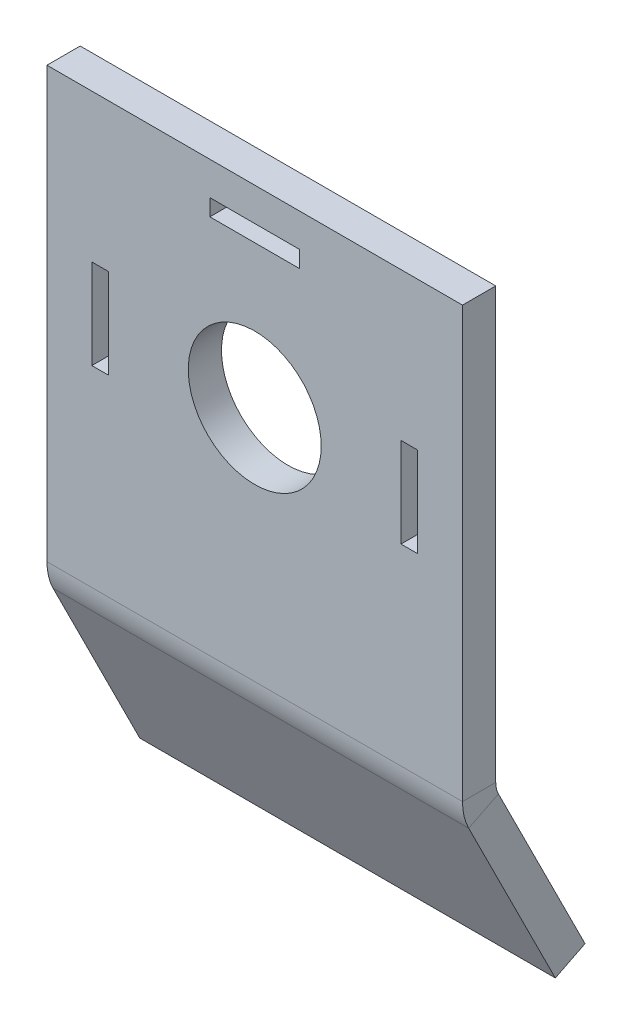
ISO-10303-21;
HEADER;
FILE_DESCRIPTION(('STEP AP214'),'2;1');
FILE_NAME('part.step','',(''),(''),'','','');
FILE_SCHEMA(('AUTOMOTIVE_DESIGN { 1 0 10303 214 1 1 1 1 }'));
ENDSEC;
DATA;
#1=APPLICATION_CONTEXT('core data for automotive mechanical design processes');
#2=APPLICATION_PROTOCOL_DEFINITION('international standard','automotive_design',2000,#1);
#3=PRODUCT_CONTEXT('',#1,'mechanical');
#4=PRODUCT('Part','Part','',(#3));
#5=PRODUCT_RELATED_PRODUCT_CATEGORY('part','',(#4));
#6=PRODUCT_DEFINITION_FORMATION('','',#4);
#7=PRODUCT_DEFINITION_CONTEXT('part definition',#1,'design');
#8=PRODUCT_DEFINITION('design','',#6,#7);
#9=PRODUCT_DEFINITION_SHAPE('','',#8);
#10=(LENGTH_UNIT() NAMED_UNIT(*) SI_UNIT(.MILLI.,.METRE.));
#11=(NAMED_UNIT(*) PLANE_ANGLE_UNIT() SI_UNIT($,.RADIAN.));
#12=(NAMED_UNIT(*) SI_UNIT($,.STERADIAN.) SOLID_ANGLE_UNIT());
#13=UNCERTAINTY_MEASURE_WITH_UNIT(LENGTH_MEASURE(1.E-05),#10,'distance_accuracy_value','');
#14=(GEOMETRIC_REPRESENTATION_CONTEXT(3) GLOBAL_UNCERTAINTY_ASSIGNED_CONTEXT((#13)) GLOBAL_UNIT_ASSIGNED_CONTEXT((#10,
#11,#12)) REPRESENTATION_CONTEXT('',''));
#15=CARTESIAN_POINT('',(0.,0.,0.));
#16=DIRECTION('',(0.,0.,1.));
#17=DIRECTION('',(1.,0.,0.));
#18=AXIS2_PLACEMENT_3D('',#15,#16,#17);
#19=CARTESIAN_POINT('',(-6.25,6.675,0.));
#20=DIRECTION('',(-1.,0.,0.));
#21=DIRECTION('',(0.,-1.,0.));
#22=AXIS2_PLACEMENT_3D('',#19,#20,#21);
#23=PLANE('',#22);
#24=DIRECTION('',(0.,1.,0.));
#25=VECTOR('',#24,1.);
#26=CARTESIAN_POINT('',(-6.25,0.,-1.));
#27=LINE('',#26,#25);
#28=CARTESIAN_POINT('',(-6.25,6.675,-1.));
#29=VERTEX_POINT('',#28);
#30=CARTESIAN_POINT('',(-6.25,-6.25895362992657,-1.));
#31=VERTEX_POINT('',#30);
#32=EDGE_CURVE('E162',#29,#31,#27,.F.);
#33=ORIENTED_EDGE('',*,*,#32,.T.);
#34=DIRECTION('',(0.,0.,1.));
#35=VECTOR('',#34,1.);
#36=CARTESIAN_POINT('',(-6.25,-6.25895362992657,-1.));
#37=LINE('',#36,#35);
#38=CARTESIAN_POINT('',(-6.25,-6.25895362992657,0.));
#39=VERTEX_POINT('',#38);
#40=EDGE_CURVE('E269',#31,#39,#37,.T.);
#41=ORIENTED_EDGE('',*,*,#40,.T.);
#42=DIRECTION('',(0.,-1.,0.));
#43=VECTOR('',#42,1.);
#44=CARTESIAN_POINT('',(-6.25,6.675,0.));
#45=LINE('',#44,#43);
#46=CARTESIAN_POINT('',(-6.25,6.675,0.));
#47=VERTEX_POINT('',#46);
#48=EDGE_CURVE('E314',#47,#39,#45,.T.);
#49=ORIENTED_EDGE('',*,*,#48,.F.);
#50=DIRECTION('',(0.,0.,1.));
#51=VECTOR('',#50,1.);
#52=CARTESIAN_POINT('',(-6.25,6.675,0.));
#53=LINE('',#52,#51);
#54=EDGE_CURVE('E150',#29,#47,#53,.T.);
#55=ORIENTED_EDGE('',*,*,#54,.F.);
#56=EDGE_LOOP('',(#33,#41,#49,#55));
#57=FACE_BOUND('',#56,.T.);
#58=ADVANCED_FACE('F65',(#57),#23,.T.);
#59=CARTESIAN_POINT('',(0.,0.,0.));
#60=DIRECTION('',(0.,0.,1.));
#61=DIRECTION('',(1.,0.,0.));
#62=AXIS2_PLACEMENT_3D('',#59,#60,#61);
#63=PLANE('',#62);
#64=DIRECTION('',(0.,1.,0.));
#65=VECTOR('',#64,1.);
#66=CARTESIAN_POINT('',(1.35,5.675,0.));
#67=LINE('',#66,#65);
#68=CARTESIAN_POINT('',(1.35,5.175,0.));
#69=VERTEX_POINT('',#68);
#70=CARTESIAN_POINT('',(1.35,5.675,0.));
#71=VERTEX_POINT('',#70);
#72=EDGE_CURVE('E171',#69,#71,#67,.T.);
#73=ORIENTED_EDGE('',*,*,#72,.F.);
#74=DIRECTION('',(1.,0.,0.));
#75=VECTOR('',#74,1.);
#76=CARTESIAN_POINT('',(-1.35,5.17500000000001,0.));
#77=LINE('',#76,#75);
#78=CARTESIAN_POINT('',(-1.35,5.17500000000001,0.));
#79=VERTEX_POINT('',#78);
#80=EDGE_CURVE('E340',#79,#69,#77,.T.);
#81=ORIENTED_EDGE('',*,*,#80,.F.);
#82=DIRECTION('',(0.,-1.,0.));
#83=VECTOR('',#82,1.);
#84=CARTESIAN_POINT('',(-1.35,5.675,0.));
#85=LINE('',#84,#83);
#86=CARTESIAN_POINT('',(-1.35,5.675,0.));
#87=VERTEX_POINT('',#86);
#88=EDGE_CURVE('E337',#87,#79,#85,.T.);
#89=ORIENTED_EDGE('',*,*,#88,.F.);
#90=DIRECTION('',(-1.,0.,0.));
#91=VECTOR('',#90,1.);
#92=CARTESIAN_POINT('',(-1.35,5.675,0.));
#93=LINE('',#92,#91);
#94=EDGE_CURVE('E334',#71,#87,#93,.T.);
#95=ORIENTED_EDGE('',*,*,#94,.F.);
#96=EDGE_LOOP('',(#73,#81,#89,#95));
#97=FACE_BOUND('',#96,.T.);
#98=DIRECTION('',(0.,1.,0.));
#99=VECTOR('',#98,1.);
#100=CARTESIAN_POINT('',(4.9,2.225,0.));
#101=LINE('',#100,#99);
#102=CARTESIAN_POINT('',(4.9,-0.474999999999997,0.));
#103=VERTEX_POINT('',#102);
#104=CARTESIAN_POINT('',(4.9,2.225,0.));
#105=VERTEX_POINT('',#104);
#106=EDGE_CURVE('E331',#103,#105,#101,.T.);
#107=ORIENTED_EDGE('',*,*,#106,.F.);
#108=DIRECTION('',(1.,0.,0.));
#109=VECTOR('',#108,1.);
#110=CARTESIAN_POINT('',(4.4,-0.474999999999998,0.));
#111=LINE('',#110,#109);
#112=CARTESIAN_POINT('',(4.4,-0.474999999999998,0.));
#113=VERTEX_POINT('',#112);
#114=EDGE_CURVE('E328',#113,#103,#111,.T.);
#115=ORIENTED_EDGE('',*,*,#114,.F.);
#116=DIRECTION('',(0.,-1.,0.));
#117=VECTOR('',#116,1.);
#118=CARTESIAN_POINT('',(4.4,2.225,0.));
#119=LINE('',#118,#117);
#120=CARTESIAN_POINT('',(4.4,2.225,0.));
#121=VERTEX_POINT('',#120);
#122=EDGE_CURVE('E325',#121,#113,#119,.T.);
#123=ORIENTED_EDGE('',*,*,#122,.F.);
#124=DIRECTION('',(-1.,0.,0.));
#125=VECTOR('',#124,1.);
#126=CARTESIAN_POINT('',(4.4,2.225,0.));
#127=LINE('',#126,#125);
#128=EDGE_CURVE('E322',#105,#121,#127,.T.);
#129=ORIENTED_EDGE('',*,*,#128,.F.);
#130=EDGE_LOOP('',(#107,#115,#123,#129));
#131=FACE_BOUND('',#130,.T.);
#132=CARTESIAN_POINT('',(0.,0.875000000000004,0.));
#133=DIRECTION('',(0.,0.,1.));
#134=DIRECTION('',(1.,0.,0.));
#135=AXIS2_PLACEMENT_3D('',#132,#133,#134);
#136=CIRCLE('',#135,2.);
#137=CARTESIAN_POINT('',(2.,0.875000000000004,0.));
#138=VERTEX_POINT('',#137);
#139=EDGE_CURVE('E311',#138,#138,#136,.T.);
#140=ORIENTED_EDGE('',*,*,#139,.F.);
#141=EDGE_LOOP('',(#140));
#142=FACE_BOUND('',#141,.T.);
#143=DIRECTION('',(-1.,0.,0.));
#144=VECTOR('',#143,1.);
#145=CARTESIAN_POINT('',(-4.4,-0.474999999999998,0.));
#146=LINE('',#145,#144);
#147=CARTESIAN_POINT('',(-4.4,-0.474999999999998,0.));
#148=VERTEX_POINT('',#147);
#149=CARTESIAN_POINT('',(-4.9,-0.474999999999997,0.));
#150=VERTEX_POINT('',#149);
#151=EDGE_CURVE('E316',#148,#150,#146,.T.);
#152=ORIENTED_EDGE('',*,*,#151,.T.);
#153=DIRECTION('',(0.,1.,0.));
#154=VECTOR('',#153,1.);
#155=CARTESIAN_POINT('',(-4.9,2.225,0.));
#156=LINE('',#155,#154);
#157=CARTESIAN_POINT('',(-4.9,2.225,0.));
#158=VERTEX_POINT('',#157);
#159=EDGE_CURVE('E146',#150,#158,#156,.T.);
#160=ORIENTED_EDGE('',*,*,#159,.T.);
#161=DIRECTION('',(1.,0.,0.));
#162=VECTOR('',#161,1.);
#163=CARTESIAN_POINT('',(-4.4,2.225,0.));
#164=LINE('',#163,#162);
#165=CARTESIAN_POINT('',(-4.4,2.225,0.));
#166=VERTEX_POINT('',#165);
#167=EDGE_CURVE('E208',#158,#166,#164,.T.);
#168=ORIENTED_EDGE('',*,*,#167,.T.);
#169=DIRECTION('',(0.,-1.,0.));
#170=VECTOR('',#169,1.);
#171=CARTESIAN_POINT('',(-4.4,2.225,0.));
#172=LINE('',#171,#170);
#173=EDGE_CURVE('E186',#166,#148,#172,.T.);
#174=ORIENTED_EDGE('',*,*,#173,.T.);
#175=EDGE_LOOP('',(#152,#160,#168,#174));
#176=FACE_BOUND('',#175,.T.);
#177=ORIENTED_EDGE('',*,*,#48,.T.);
#178=DIRECTION('',(-1.,0.,0.));
#179=VECTOR('',#178,1.);
#180=CARTESIAN_POINT('',(-6.25,-6.25895362992657,0.));
#181=LINE('',#180,#179);
#182=CARTESIAN_POINT('',(6.25,-6.25895362992657,0.));
#183=VERTEX_POINT('',#182);
#184=EDGE_CURVE('E310',#39,#183,#181,.F.);
#185=ORIENTED_EDGE('',*,*,#184,.T.);
#186=DIRECTION('',(0.,1.,0.));
#187=VECTOR('',#186,1.);
#188=CARTESIAN_POINT('',(6.25,6.675,0.));
#189=LINE('',#188,#187);
#190=CARTESIAN_POINT('',(6.25,6.675,0.));
#191=VERTEX_POINT('',#190);
#192=EDGE_CURVE('E308',#183,#191,#189,.T.);
#193=ORIENTED_EDGE('',*,*,#192,.T.);
#194=DIRECTION('',(-1.,0.,0.));
#195=VECTOR('',#194,1.);
#196=CARTESIAN_POINT('',(-6.25,6.675,0.));
#197=LINE('',#196,#195);
#198=EDGE_CURVE('E309',#191,#47,#197,.T.);
#199=ORIENTED_EDGE('',*,*,#198,.T.);
#200=EDGE_LOOP('',(#177,#185,#193,#199));
#201=FACE_BOUND('',#200,.T.);
#202=ADVANCED_FACE('F211',(#97,#131,#142,#176,#201),#63,.T.);
#203=CARTESIAN_POINT('',(0.,0.,-1.));
#204=DIRECTION('',(0.,0.,1.));
#205=DIRECTION('',(1.,0.,0.));
#206=AXIS2_PLACEMENT_3D('',#203,#204,#205);
#207=PLANE('',#206);
#208=DIRECTION('',(1.,0.,0.));
#209=VECTOR('',#208,1.);
#210=CARTESIAN_POINT('',(0.,-0.474999999999998,-1.));
#211=LINE('',#210,#209);
#212=CARTESIAN_POINT('',(-4.4,-0.474999999999998,-1.));
#213=VERTEX_POINT('',#212);
#214=CARTESIAN_POINT('',(-4.9,-0.474999999999997,-1.));
#215=VERTEX_POINT('',#214);
#216=EDGE_CURVE('E157',#213,#215,#211,.F.);
#217=ORIENTED_EDGE('',*,*,#216,.F.);
#218=DIRECTION('',(0.,1.,0.));
#219=VECTOR('',#218,1.);
#220=CARTESIAN_POINT('',(-4.4,0.,-1.));
#221=LINE('',#220,#219);
#222=CARTESIAN_POINT('',(-4.4,2.225,-1.));
#223=VERTEX_POINT('',#222);
#224=EDGE_CURVE('E169',#223,#213,#221,.F.);
#225=ORIENTED_EDGE('',*,*,#224,.F.);
#226=DIRECTION('',(1.,0.,0.));
#227=VECTOR('',#226,1.);
#228=CARTESIAN_POINT('',(0.,2.225,-1.));
#229=LINE('',#228,#227);
#230=CARTESIAN_POINT('',(-4.9,2.225,-1.));
#231=VERTEX_POINT('',#230);
#232=EDGE_CURVE('E159',#231,#223,#229,.T.);
#233=ORIENTED_EDGE('',*,*,#232,.F.);
#234=DIRECTION('',(0.,1.,0.));
#235=VECTOR('',#234,1.);
#236=CARTESIAN_POINT('',(-4.9,0.,-1.));
#237=LINE('',#236,#235);
#238=EDGE_CURVE('E143',#215,#231,#237,.T.);
#239=ORIENTED_EDGE('',*,*,#238,.F.);
#240=EDGE_LOOP('',(#217,#225,#233,#239));
#241=FACE_BOUND('',#240,.T.);
#242=CARTESIAN_POINT('',(0.,0.875000000000004,-1.));
#243=DIRECTION('',(0.,0.,1.));
#244=DIRECTION('',(1.,0.,0.));
#245=AXIS2_PLACEMENT_3D('',#242,#243,#244);
#246=CIRCLE('',#245,2.);
#247=CARTESIAN_POINT('',(2.,0.875000000000004,-1.));
#248=VERTEX_POINT('',#247);
#249=EDGE_CURVE('E238',#248,#248,#246,.T.);
#250=ORIENTED_EDGE('',*,*,#249,.T.);
#251=EDGE_LOOP('',(#250));
#252=FACE_BOUND('',#251,.T.);
#253=DIRECTION('',(0.,1.,0.));
#254=VECTOR('',#253,1.);
#255=CARTESIAN_POINT('',(4.9,0.,-1.));
#256=LINE('',#255,#254);
#257=CARTESIAN_POINT('',(4.9,-0.474999999999997,-1.));
#258=VERTEX_POINT('',#257);
#259=CARTESIAN_POINT('',(4.9,2.225,-1.));
#260=VERTEX_POINT('',#259);
#261=EDGE_CURVE('E226',#258,#260,#256,.T.);
#262=ORIENTED_EDGE('',*,*,#261,.T.);
#263=DIRECTION('',(1.,0.,0.));
#264=VECTOR('',#263,1.);
#265=CARTESIAN_POINT('',(0.,2.225,-1.));
#266=LINE('',#265,#264);
#267=CARTESIAN_POINT('',(4.4,2.225,-1.));
#268=VERTEX_POINT('',#267);
#269=EDGE_CURVE('E235',#260,#268,#266,.F.);
#270=ORIENTED_EDGE('',*,*,#269,.T.);
#271=DIRECTION('',(0.,1.,0.));
#272=VECTOR('',#271,1.);
#273=CARTESIAN_POINT('',(4.4,0.,-1.));
#274=LINE('',#273,#272);
#275=CARTESIAN_POINT('',(4.4,-0.474999999999998,-1.));
#276=VERTEX_POINT('',#275);
#277=EDGE_CURVE('E239',#268,#276,#274,.F.);
#278=ORIENTED_EDGE('',*,*,#277,.T.);
#279=DIRECTION('',(1.,0.,0.));
#280=VECTOR('',#279,1.);
#281=CARTESIAN_POINT('',(0.,-0.474999999999998,-1.));
#282=LINE('',#281,#280);
#283=EDGE_CURVE('E234',#276,#258,#282,.T.);
#284=ORIENTED_EDGE('',*,*,#283,.T.);
#285=EDGE_LOOP('',(#262,#270,#278,#284));
#286=FACE_BOUND('',#285,.T.);
#287=DIRECTION('',(0.,1.,0.));
#288=VECTOR('',#287,1.);
#289=CARTESIAN_POINT('',(1.35,0.,-1.));
#290=LINE('',#289,#288);
#291=CARTESIAN_POINT('',(1.35,5.175,-1.));
#292=VERTEX_POINT('',#291);
#293=CARTESIAN_POINT('',(1.35,5.675,-1.));
#294=VERTEX_POINT('',#293);
#295=EDGE_CURVE('E218',#292,#294,#290,.T.);
#296=ORIENTED_EDGE('',*,*,#295,.T.);
#297=DIRECTION('',(1.,0.,0.));
#298=VECTOR('',#297,1.);
#299=CARTESIAN_POINT('',(0.,5.675,-1.));
#300=LINE('',#299,#298);
#301=CARTESIAN_POINT('',(-1.35,5.675,-1.));
#302=VERTEX_POINT('',#301);
#303=EDGE_CURVE('E223',#294,#302,#300,.F.);
#304=ORIENTED_EDGE('',*,*,#303,.T.);
#305=DIRECTION('',(0.,1.,0.));
#306=VECTOR('',#305,1.);
#307=CARTESIAN_POINT('',(-1.35,0.,-1.));
#308=LINE('',#307,#306);
#309=CARTESIAN_POINT('',(-1.35,5.17500000000001,-1.));
#310=VERTEX_POINT('',#309);
#311=EDGE_CURVE('E227',#302,#310,#308,.F.);
#312=ORIENTED_EDGE('',*,*,#311,.T.);
#313=DIRECTION('',(1.,0.,0.));
#314=VECTOR('',#313,1.);
#315=CARTESIAN_POINT('',(0.,5.17500000000001,-1.));
#316=LINE('',#315,#314);
#317=EDGE_CURVE('E221',#310,#292,#316,.T.);
#318=ORIENTED_EDGE('',*,*,#317,.T.);
#319=EDGE_LOOP('',(#296,#304,#312,#318));
#320=FACE_BOUND('',#319,.T.);
#321=DIRECTION('',(-1.,0.,0.));
#322=VECTOR('',#321,1.);
#323=CARTESIAN_POINT('',(-6.25,-6.25895362992657,-1.));
#324=LINE('',#323,#322);
#325=CARTESIAN_POINT('',(6.25,-6.25895362992657,-1.));
#326=VERTEX_POINT('',#325);
#327=EDGE_CURVE('E264',#31,#326,#324,.F.);
#328=ORIENTED_EDGE('',*,*,#327,.F.);
#329=ORIENTED_EDGE('',*,*,#32,.F.);
#330=DIRECTION('',(1.,0.,0.));
#331=VECTOR('',#330,1.);
#332=CARTESIAN_POINT('',(0.,6.675,-1.));
#333=LINE('',#332,#331);
#334=CARTESIAN_POINT('',(6.25,6.675,-1.));
#335=VERTEX_POINT('',#334);
#336=EDGE_CURVE('E165',#335,#29,#333,.F.);
#337=ORIENTED_EDGE('',*,*,#336,.F.);
#338=DIRECTION('',(0.,1.,0.));
#339=VECTOR('',#338,1.);
#340=CARTESIAN_POINT('',(6.25,0.,-1.));
#341=LINE('',#340,#339);
#342=EDGE_CURVE('E246',#326,#335,#341,.T.);
#343=ORIENTED_EDGE('',*,*,#342,.F.);
#344=EDGE_LOOP('',(#328,#329,#337,#343));
#345=FACE_BOUND('',#344,.T.);
#346=ADVANCED_FACE('F154',(#241,#252,#286,#320,#345),#207,.F.);
#347=CARTESIAN_POINT('',(-4.4,2.225,0.));
#348=DIRECTION('',(0.,-1.,0.));
#349=DIRECTION('',(1.,0.,0.));
#350=AXIS2_PLACEMENT_3D('',#347,#348,#349);
#351=PLANE('',#350);
#352=DIRECTION('',(0.,0.,1.));
#353=VECTOR('',#352,1.);
#354=CARTESIAN_POINT('',(-4.9,2.225,0.));
#355=LINE('',#354,#353);
#356=EDGE_CURVE('E13',#231,#158,#355,.T.);
#357=ORIENTED_EDGE('',*,*,#356,.F.);
#358=ORIENTED_EDGE('',*,*,#232,.T.);
#359=DIRECTION('',(0.,0.,1.));
#360=VECTOR('',#359,1.);
#361=CARTESIAN_POINT('',(-4.4,2.225,0.));
#362=LINE('',#361,#360);
#363=EDGE_CURVE('E74',#223,#166,#362,.T.);
#364=ORIENTED_EDGE('',*,*,#363,.T.);
#365=ORIENTED_EDGE('',*,*,#167,.F.);
#366=EDGE_LOOP('',(#357,#358,#364,#365));
#367=FACE_BOUND('',#366,.T.);
#368=ADVANCED_FACE('F207',(#367),#351,.T.);
#369=CARTESIAN_POINT('',(-4.4,2.225,0.));
#370=DIRECTION('',(-1.,0.,0.));
#371=DIRECTION('',(0.,-1.,0.));
#372=AXIS2_PLACEMENT_3D('',#369,#370,#371);
#373=PLANE('',#372);
#374=ORIENTED_EDGE('',*,*,#363,.F.);
#375=ORIENTED_EDGE('',*,*,#224,.T.);
#376=DIRECTION('',(0.,0.,1.));
#377=VECTOR('',#376,1.);
#378=CARTESIAN_POINT('',(-4.4,-0.474999999999998,0.));
#379=LINE('',#378,#377);
#380=EDGE_CURVE('E90',#213,#148,#379,.T.);
#381=ORIENTED_EDGE('',*,*,#380,.T.);
#382=ORIENTED_EDGE('',*,*,#173,.F.);
#383=EDGE_LOOP('',(#374,#375,#381,#382));
#384=FACE_BOUND('',#383,.T.);
#385=ADVANCED_FACE('F214',(#384),#373,.T.);
#386=CARTESIAN_POINT('',(-4.4,-0.474999999999998,0.));
#387=DIRECTION('',(0.,1.,0.));
#388=DIRECTION('',(-1.,0.,0.));
#389=AXIS2_PLACEMENT_3D('',#386,#387,#388);
#390=PLANE('',#389);
#391=ORIENTED_EDGE('',*,*,#380,.F.);
#392=ORIENTED_EDGE('',*,*,#216,.T.);
#393=DIRECTION('',(0.,0.,1.));
#394=VECTOR('',#393,1.);
#395=CARTESIAN_POINT('',(-4.9,-0.474999999999997,0.));
#396=LINE('',#395,#394);
#397=EDGE_CURVE('E69',#215,#150,#396,.T.);
#398=ORIENTED_EDGE('',*,*,#397,.T.);
#399=ORIENTED_EDGE('',*,*,#151,.F.);
#400=EDGE_LOOP('',(#391,#392,#398,#399));
#401=FACE_BOUND('',#400,.T.);
#402=ADVANCED_FACE('F161',(#401),#390,.T.);
#403=CARTESIAN_POINT('',(6.25,6.675,0.));
#404=DIRECTION('',(1.,0.,0.));
#405=DIRECTION('',(0.,1.,0.));
#406=AXIS2_PLACEMENT_3D('',#403,#404,#405);
#407=PLANE('',#406);
#408=DIRECTION('',(0.,0.,1.));
#409=VECTOR('',#408,1.);
#410=CARTESIAN_POINT('',(6.25,-6.25895362992657,-1.));
#411=LINE('',#410,#409);
#412=EDGE_CURVE('E222',#326,#183,#411,.T.);
#413=ORIENTED_EDGE('',*,*,#412,.F.);
#414=ORIENTED_EDGE('',*,*,#342,.T.);
#415=DIRECTION('',(0.,0.,1.));
#416=VECTOR('',#415,1.);
#417=CARTESIAN_POINT('',(6.25,6.675,0.));
#418=LINE('',#417,#416);
#419=EDGE_CURVE('E196',#335,#191,#418,.T.);
#420=ORIENTED_EDGE('',*,*,#419,.T.);
#421=ORIENTED_EDGE('',*,*,#192,.F.);
#422=EDGE_LOOP('',(#413,#414,#420,#421));
#423=FACE_BOUND('',#422,.T.);
#424=ADVANCED_FACE('F313',(#423),#407,.T.);
#425=CARTESIAN_POINT('',(4.4,2.225,0.));
#426=DIRECTION('',(-1.,0.,0.));
#427=DIRECTION('',(0.,-1.,0.));
#428=AXIS2_PLACEMENT_3D('',#425,#426,#427);
#429=PLANE('',#428);
#430=DIRECTION('',(0.,0.,1.));
#431=VECTOR('',#430,1.);
#432=CARTESIAN_POINT('',(4.4,-0.474999999999998,0.));
#433=LINE('',#432,#431);
#434=EDGE_CURVE('E193',#276,#113,#433,.T.);
#435=ORIENTED_EDGE('',*,*,#434,.F.);
#436=ORIENTED_EDGE('',*,*,#277,.F.);
#437=DIRECTION('',(0.,0.,1.));
#438=VECTOR('',#437,1.);
#439=CARTESIAN_POINT('',(4.4,2.225,0.));
#440=LINE('',#439,#438);
#441=EDGE_CURVE('E190',#268,#121,#440,.T.);
#442=ORIENTED_EDGE('',*,*,#441,.T.);
#443=ORIENTED_EDGE('',*,*,#122,.T.);
#444=EDGE_LOOP('',(#435,#436,#442,#443));
#445=FACE_BOUND('',#444,.T.);
#446=ADVANCED_FACE('F497',(#445),#429,.F.);
#447=CARTESIAN_POINT('',(4.4,2.225,0.));
#448=DIRECTION('',(0.,1.,0.));
#449=DIRECTION('',(-1.,0.,0.));
#450=AXIS2_PLACEMENT_3D('',#447,#448,#449);
#451=PLANE('',#450);
#452=ORIENTED_EDGE('',*,*,#441,.F.);
#453=ORIENTED_EDGE('',*,*,#269,.F.);
#454=DIRECTION('',(0.,0.,1.));
#455=VECTOR('',#454,1.);
#456=CARTESIAN_POINT('',(4.9,2.225,0.));
#457=LINE('',#456,#455);
#458=EDGE_CURVE('E187',#260,#105,#457,.T.);
#459=ORIENTED_EDGE('',*,*,#458,.T.);
#460=ORIENTED_EDGE('',*,*,#128,.T.);
#461=EDGE_LOOP('',(#452,#453,#459,#460));
#462=FACE_BOUND('',#461,.T.);
#463=ADVANCED_FACE('F493',(#462),#451,.F.);
#464=CARTESIAN_POINT('',(4.9,2.225,0.));
#465=DIRECTION('',(1.,0.,0.));
#466=DIRECTION('',(0.,1.,0.));
#467=AXIS2_PLACEMENT_3D('',#464,#465,#466);
#468=PLANE('',#467);
#469=ORIENTED_EDGE('',*,*,#458,.F.);
#470=ORIENTED_EDGE('',*,*,#261,.F.);
#471=DIRECTION('',(0.,0.,1.));
#472=VECTOR('',#471,1.);
#473=CARTESIAN_POINT('',(4.9,-0.474999999999997,0.));
#474=LINE('',#473,#472);
#475=EDGE_CURVE('E183',#258,#103,#474,.T.);
#476=ORIENTED_EDGE('',*,*,#475,.T.);
#477=ORIENTED_EDGE('',*,*,#106,.T.);
#478=EDGE_LOOP('',(#469,#470,#476,#477));
#479=FACE_BOUND('',#478,.T.);
#480=ADVANCED_FACE('F485',(#479),#468,.F.);
#481=CARTESIAN_POINT('',(-1.35,5.675,0.));
#482=DIRECTION('',(-1.,0.,0.));
#483=DIRECTION('',(0.,-1.,0.));
#484=AXIS2_PLACEMENT_3D('',#481,#482,#483);
#485=PLANE('',#484);
#486=DIRECTION('',(0.,0.,1.));
#487=VECTOR('',#486,1.);
#488=CARTESIAN_POINT('',(-1.35,5.17500000000001,0.));
#489=LINE('',#488,#487);
#490=EDGE_CURVE('E180',#310,#79,#489,.T.);
#491=ORIENTED_EDGE('',*,*,#490,.F.);
#492=ORIENTED_EDGE('',*,*,#311,.F.);
#493=DIRECTION('',(0.,0.,1.));
#494=VECTOR('',#493,1.);
#495=CARTESIAN_POINT('',(-1.35,5.675,0.));
#496=LINE('',#495,#494);
#497=EDGE_CURVE('E176',#302,#87,#496,.T.);
#498=ORIENTED_EDGE('',*,*,#497,.T.);
#499=ORIENTED_EDGE('',*,*,#88,.T.);
#500=EDGE_LOOP('',(#491,#492,#498,#499));
#501=FACE_BOUND('',#500,.T.);
#502=ADVANCED_FACE('F481',(#501),#485,.F.);
#503=CARTESIAN_POINT('',(-1.35,5.675,0.));
#504=DIRECTION('',(0.,1.,0.));
#505=DIRECTION('',(-1.,0.,0.));
#506=AXIS2_PLACEMENT_3D('',#503,#504,#505);
#507=PLANE('',#506);
#508=ORIENTED_EDGE('',*,*,#497,.F.);
#509=ORIENTED_EDGE('',*,*,#303,.F.);
#510=DIRECTION('',(0.,0.,1.));
#511=VECTOR('',#510,1.);
#512=CARTESIAN_POINT('',(1.35,5.675,0.));
#513=LINE('',#512,#511);
#514=EDGE_CURVE('E173',#294,#71,#513,.T.);
#515=ORIENTED_EDGE('',*,*,#514,.T.);
#516=ORIENTED_EDGE('',*,*,#94,.T.);
#517=EDGE_LOOP('',(#508,#509,#515,#516));
#518=FACE_BOUND('',#517,.T.);
#519=ADVANCED_FACE('F477',(#518),#507,.F.);
#520=CARTESIAN_POINT('',(1.35,5.675,0.));
#521=DIRECTION('',(1.,0.,0.));
#522=DIRECTION('',(0.,1.,0.));
#523=AXIS2_PLACEMENT_3D('',#520,#521,#522);
#524=PLANE('',#523);
#525=ORIENTED_EDGE('',*,*,#514,.F.);
#526=ORIENTED_EDGE('',*,*,#295,.F.);
#527=DIRECTION('',(0.,0.,1.));
#528=VECTOR('',#527,1.);
#529=CARTESIAN_POINT('',(1.35,5.175,0.));
#530=LINE('',#529,#528);
#531=EDGE_CURVE('E177',#292,#69,#530,.T.);
#532=ORIENTED_EDGE('',*,*,#531,.T.);
#533=ORIENTED_EDGE('',*,*,#72,.T.);
#534=EDGE_LOOP('',(#525,#526,#532,#533));
#535=FACE_BOUND('',#534,.T.);
#536=ADVANCED_FACE('F473',(#535),#524,.F.);
#537=CARTESIAN_POINT('',(-1.35,5.17500000000001,0.));
#538=DIRECTION('',(0.,-1.,0.));
#539=DIRECTION('',(1.,0.,0.));
#540=AXIS2_PLACEMENT_3D('',#537,#538,#539);
#541=PLANE('',#540);
#542=ORIENTED_EDGE('',*,*,#317,.F.);
#543=ORIENTED_EDGE('',*,*,#490,.T.);
#544=ORIENTED_EDGE('',*,*,#80,.T.);
#545=ORIENTED_EDGE('',*,*,#531,.F.);
#546=EDGE_LOOP('',(#542,#543,#544,#545));
#547=FACE_BOUND('',#546,.T.);
#548=ADVANCED_FACE('F476',(#547),#541,.F.);
#549=CARTESIAN_POINT('',(4.4,-0.474999999999998,0.));
#550=DIRECTION('',(0.,-1.,0.));
#551=DIRECTION('',(1.,0.,0.));
#552=AXIS2_PLACEMENT_3D('',#549,#550,#551);
#553=PLANE('',#552);
#554=ORIENTED_EDGE('',*,*,#283,.F.);
#555=ORIENTED_EDGE('',*,*,#434,.T.);
#556=ORIENTED_EDGE('',*,*,#114,.T.);
#557=ORIENTED_EDGE('',*,*,#475,.F.);
#558=EDGE_LOOP('',(#554,#555,#556,#557));
#559=FACE_BOUND('',#558,.T.);
#560=ADVANCED_FACE('F489',(#559),#553,.F.);
#561=CARTESIAN_POINT('',(0.,0.875000000000004,0.));
#562=DIRECTION('',(0.,0.,1.));
#563=DIRECTION('',(1.,0.,0.));
#564=AXIS2_PLACEMENT_3D('',#561,#562,#563);
#565=CYLINDRICAL_SURFACE('',#564,2.);
#566=ORIENTED_EDGE('',*,*,#139,.T.);
#567=EDGE_LOOP('',(#566));
#568=FACE_BOUND('',#567,.T.);
#569=ORIENTED_EDGE('',*,*,#249,.F.);
#570=EDGE_LOOP('',(#569));
#571=FACE_BOUND('',#570,.T.);
#572=ADVANCED_FACE('F460',(#568,#571),#565,.F.);
#573=CARTESIAN_POINT('',(-6.25,6.675,0.));
#574=DIRECTION('',(0.,1.,0.));
#575=DIRECTION('',(-1.,0.,0.));
#576=AXIS2_PLACEMENT_3D('',#573,#574,#575);
#577=PLANE('',#576);
#578=ORIENTED_EDGE('',*,*,#336,.T.);
#579=ORIENTED_EDGE('',*,*,#54,.T.);
#580=ORIENTED_EDGE('',*,*,#198,.F.);
#581=ORIENTED_EDGE('',*,*,#419,.F.);
#582=EDGE_LOOP('',(#578,#579,#580,#581));
#583=FACE_BOUND('',#582,.T.);
#584=ADVANCED_FACE('F254',(#583),#577,.T.);
#585=CARTESIAN_POINT('',(-4.9,2.225,0.));
#586=DIRECTION('',(1.,0.,0.));
#587=DIRECTION('',(0.,1.,0.));
#588=AXIS2_PLACEMENT_3D('',#585,#586,#587);
#589=PLANE('',#588);
#590=ORIENTED_EDGE('',*,*,#238,.T.);
#591=ORIENTED_EDGE('',*,*,#356,.T.);
#592=ORIENTED_EDGE('',*,*,#159,.F.);
#593=ORIENTED_EDGE('',*,*,#397,.F.);
#594=EDGE_LOOP('',(#590,#591,#592,#593));
#595=FACE_BOUND('',#594,.T.);
#596=ADVANCED_FACE('F67',(#595),#589,.T.);
#597=CARTESIAN_POINT('',(6.25,-6.25895362992657,-1.76));
#598=DIRECTION('',(1.,0.,0.));
#599=DIRECTION('',(0.,0.,-1.));
#600=AXIS2_PLACEMENT_3D('',#597,#598,#599);
#601=PLANE('',#600);
#602=DIRECTION('',(0.,-0.447759087838764,0.894154236839371));
#603=VECTOR('',#602,1.);
#604=CARTESIAN_POINT('',(6.25,-7.04700962452279,-0.186288543162708));
#605=LINE('',#604,#603);
#606=CARTESIAN_POINT('',(6.25,-6.59925053668403,-1.08044278000208));
#607=VERTEX_POINT('',#606);
#608=CARTESIAN_POINT('',(6.25,-7.04700962452279,-0.186288543162707));
#609=VERTEX_POINT('',#608);
#610=EDGE_CURVE('E358',#607,#609,#605,.T.);
#611=ORIENTED_EDGE('',*,*,#610,.F.);
#612=CARTESIAN_POINT('',(6.25,-6.25895362992657,-1.76));
#613=DIRECTION('',(-1.,0.,0.));
#614=DIRECTION('',(0.,0.,1.));
#615=AXIS2_PLACEMENT_3D('',#612,#613,#614);
#616=CIRCLE('',#615,0.760000000000001);
#617=EDGE_CURVE('E351',#326,#607,#616,.F.);
#618=ORIENTED_EDGE('',*,*,#617,.F.);
#619=ORIENTED_EDGE('',*,*,#412,.T.);
#620=CARTESIAN_POINT('',(6.25,-6.25895362992657,-1.76));
#621=DIRECTION('',(-1.,0.,0.));
#622=DIRECTION('',(0.,0.,1.));
#623=AXIS2_PLACEMENT_3D('',#620,#621,#622);
#624=CIRCLE('',#623,1.76);
#625=EDGE_CURVE('E81',#183,#609,#624,.F.);
#626=ORIENTED_EDGE('',*,*,#625,.T.);
#627=EDGE_LOOP('',(#611,#618,#619,#626));
#628=FACE_BOUND('',#627,.T.);
#629=ADVANCED_FACE('F427',(#628),#601,.T.);
#630=CARTESIAN_POINT('',(-6.25,-6.25895362992657,-1.76));
#631=DIRECTION('',(1.,0.,0.));
#632=DIRECTION('',(0.,0.,-1.));
#633=AXIS2_PLACEMENT_3D('',#630,#631,#632);
#634=PLANE('',#633);
#635=CARTESIAN_POINT('',(-6.25,-6.25895362992657,-1.76));
#636=DIRECTION('',(-1.,0.,0.));
#637=DIRECTION('',(0.,0.,1.));
#638=AXIS2_PLACEMENT_3D('',#635,#636,#637);
#639=CIRCLE('',#638,0.760000000000001);
#640=CARTESIAN_POINT('',(-6.25,-6.59925053668403,-1.08044278000208));
#641=VERTEX_POINT('',#640);
#642=EDGE_CURVE('E347',#641,#31,#639,.T.);
#643=ORIENTED_EDGE('',*,*,#642,.F.);
#644=DIRECTION('',(0.,-0.447759087838764,0.894154236839371));
#645=VECTOR('',#644,1.);
#646=CARTESIAN_POINT('',(-6.25,-6.59925053668403,-1.08044278000208));
#647=LINE('',#646,#645);
#648=CARTESIAN_POINT('',(-6.25,-7.04700962452279,-0.186288543162707));
#649=VERTEX_POINT('',#648);
#650=EDGE_CURVE('E363',#641,#649,#647,.T.);
#651=ORIENTED_EDGE('',*,*,#650,.T.);
#652=CARTESIAN_POINT('',(-6.25,-6.25895362992657,-1.76));
#653=DIRECTION('',(-1.,0.,0.));
#654=DIRECTION('',(0.,0.,1.));
#655=AXIS2_PLACEMENT_3D('',#652,#653,#654);
#656=CIRCLE('',#655,1.76);
#657=EDGE_CURVE('E354',#649,#39,#656,.T.);
#658=ORIENTED_EDGE('',*,*,#657,.T.);
#659=ORIENTED_EDGE('',*,*,#40,.F.);
#660=EDGE_LOOP('',(#643,#651,#658,#659));
#661=FACE_BOUND('',#660,.T.);
#662=ADVANCED_FACE('F418',(#661),#634,.F.);
#663=CARTESIAN_POINT('',(-6.25,-6.25895362992657,-1.76));
#664=DIRECTION('',(-1.,0.,0.));
#665=DIRECTION('',(0.,-0.447759087838764,0.894154236839371));
#666=AXIS2_PLACEMENT_3D('',#663,#664,#665);
#667=CYLINDRICAL_SURFACE('',#666,1.76);
#668=ORIENTED_EDGE('',*,*,#184,.F.);
#669=ORIENTED_EDGE('',*,*,#657,.F.);
#670=DIRECTION('',(-1.,0.,0.));
#671=VECTOR('',#670,1.);
#672=CARTESIAN_POINT('',(0.,-7.04700962452279,-0.186288543162707));
#673=LINE('',#672,#671);
#674=EDGE_CURVE('E366',#609,#649,#673,.T.);
#675=ORIENTED_EDGE('',*,*,#674,.F.);
#676=ORIENTED_EDGE('',*,*,#625,.F.);
#677=EDGE_LOOP('',(#668,#669,#675,#676));
#678=FACE_BOUND('',#677,.T.);
#679=ADVANCED_FACE('F424',(#678),#667,.T.);
#680=CARTESIAN_POINT('',(-6.25,-6.25895362992657,-1.76));
#681=DIRECTION('',(-1.,0.,0.));
#682=DIRECTION('',(0.,-0.447759087838764,0.894154236839371));
#683=AXIS2_PLACEMENT_3D('',#680,#681,#682);
#684=CYLINDRICAL_SURFACE('',#683,0.760000000000001);
#685=ORIENTED_EDGE('',*,*,#327,.T.);
#686=ORIENTED_EDGE('',*,*,#617,.T.);
#687=DIRECTION('',(1.,0.,0.));
#688=VECTOR('',#687,1.);
#689=CARTESIAN_POINT('',(6.25,-6.59925053668403,-1.08044278000208));
#690=LINE('',#689,#688);
#691=EDGE_CURVE('E361',#607,#641,#690,.F.);
#692=ORIENTED_EDGE('',*,*,#691,.T.);
#693=ORIENTED_EDGE('',*,*,#642,.T.);
#694=EDGE_LOOP('',(#685,#686,#692,#693));
#695=FACE_BOUND('',#694,.T.);
#696=ADVANCED_FACE('F442',(#695),#684,.F.);
#697=CARTESIAN_POINT('',(-6.25,-6.88636910484249,-0.105845763160629));
#698=DIRECTION('',(-1.,0.,0.));
#699=DIRECTION('',(0.,0.,1.));
#700=AXIS2_PLACEMENT_3D('',#697,#698,#699);
#701=PLANE('',#700);
#702=DIRECTION('',(0.,0.894154236839371,0.447759087838764));
#703=VECTOR('',#702,1.);
#704=CARTESIAN_POINT('',(-6.25,-6.88636910484249,-0.105845763160629));
#705=LINE('',#704,#703);
#706=CARTESIAN_POINT('',(-6.25,-12.2512945258787,-2.79240029019321));
#707=VERTEX_POINT('',#706);
#708=EDGE_CURVE('E388',#707,#649,#705,.T.);
#709=ORIENTED_EDGE('',*,*,#708,.T.);
#710=ORIENTED_EDGE('',*,*,#650,.F.);
#711=DIRECTION('',(0.,-0.894154236839371,-0.447759087838764));
#712=VECTOR('',#711,1.);
#713=CARTESIAN_POINT('',(-6.25,-0.701503071483568,1.87292915128358));
#714=LINE('',#713,#712);
#715=CARTESIAN_POINT('',(-6.25,-11.80353543804,-3.68655452703258));
#716=VERTEX_POINT('',#715);
#717=EDGE_CURVE('E377',#716,#641,#714,.F.);
#718=ORIENTED_EDGE('',*,*,#717,.F.);
#719=DIRECTION('',(0.,0.447759087838764,-0.894154236839371));
#720=VECTOR('',#719,1.);
#721=CARTESIAN_POINT('',(-6.25,-12.2512945258787,-2.79240029019321));
#722=LINE('',#721,#720);
#723=EDGE_CURVE('E349',#707,#716,#722,.T.);
#724=ORIENTED_EDGE('',*,*,#723,.F.);
#725=EDGE_LOOP('',(#709,#710,#718,#724));
#726=FACE_BOUND('',#725,.T.);
#727=ADVANCED_FACE('F417',(#726),#701,.T.);
#728=CARTESIAN_POINT('',(6.25,-12.2512945258787,-2.79240029019321));
#729=DIRECTION('',(1.,0.,0.));
#730=DIRECTION('',(0.,0.,-1.));
#731=AXIS2_PLACEMENT_3D('',#728,#729,#730);
#732=PLANE('',#731);
#733=DIRECTION('',(0.,0.894154236839371,0.447759087838764));
#734=VECTOR('',#733,1.);
#735=CARTESIAN_POINT('',(6.25,-0.701503071483568,1.87292915128358));
#736=LINE('',#735,#734);
#737=CARTESIAN_POINT('',(6.25,-11.80353543804,-3.68655452703258));
#738=VERTEX_POINT('',#737);
#739=EDGE_CURVE('E370',#607,#738,#736,.F.);
#740=ORIENTED_EDGE('',*,*,#739,.F.);
#741=ORIENTED_EDGE('',*,*,#610,.T.);
#742=DIRECTION('',(0.,-0.894154236839371,-0.447759087838764));
#743=VECTOR('',#742,1.);
#744=CARTESIAN_POINT('',(6.25,-12.2512945258787,-2.79240029019321));
#745=LINE('',#744,#743);
#746=CARTESIAN_POINT('',(6.25,-12.2512945258787,-2.79240029019321));
#747=VERTEX_POINT('',#746);
#748=EDGE_CURVE('E381',#609,#747,#745,.T.);
#749=ORIENTED_EDGE('',*,*,#748,.T.);
#750=DIRECTION('',(0.,0.447759087838764,-0.894154236839371));
#751=VECTOR('',#750,1.);
#752=CARTESIAN_POINT('',(6.25,-12.2512945258787,-2.79240029019321));
#753=LINE('',#752,#751);
#754=EDGE_CURVE('E392',#747,#738,#753,.T.);
#755=ORIENTED_EDGE('',*,*,#754,.T.);
#756=EDGE_LOOP('',(#740,#741,#749,#755));
#757=FACE_BOUND('',#756,.T.);
#758=ADVANCED_FACE('F430',(#757),#732,.T.);
#759=CARTESIAN_POINT('',(0.,-1.14926215932233,2.76708338812295));
#760=DIRECTION('',(0.,-0.447759087838764,0.894154236839371));
#761=DIRECTION('',(0.,-0.894154236839371,-0.447759087838764));
#762=AXIS2_PLACEMENT_3D('',#759,#760,#761);
#763=PLANE('',#762);
#764=ORIENTED_EDGE('',*,*,#748,.F.);
#765=ORIENTED_EDGE('',*,*,#674,.T.);
#766=ORIENTED_EDGE('',*,*,#708,.F.);
#767=DIRECTION('',(-1.,0.,0.));
#768=VECTOR('',#767,1.);
#769=CARTESIAN_POINT('',(-6.25,-12.2512945258787,-2.79240029019321));
#770=LINE('',#769,#768);
#771=EDGE_CURVE('E384',#747,#707,#770,.T.);
#772=ORIENTED_EDGE('',*,*,#771,.F.);
#773=EDGE_LOOP('',(#764,#765,#766,#772));
#774=FACE_BOUND('',#773,.T.);
#775=ADVANCED_FACE('F423',(#774),#763,.T.);
#776=CARTESIAN_POINT('',(0.,-0.701503071483568,1.87292915128358));
#777=DIRECTION('',(0.,-0.447759087838764,0.894154236839371));
#778=DIRECTION('',(0.,-0.894154236839371,-0.447759087838764));
#779=AXIS2_PLACEMENT_3D('',#776,#777,#778);
#780=PLANE('',#779);
#781=ORIENTED_EDGE('',*,*,#691,.F.);
#782=ORIENTED_EDGE('',*,*,#739,.T.);
#783=DIRECTION('',(1.,0.,0.));
#784=VECTOR('',#783,1.);
#785=CARTESIAN_POINT('',(0.,-11.80353543804,-3.68655452703258));
#786=LINE('',#785,#784);
#787=EDGE_CURVE('E373',#738,#716,#786,.F.);
#788=ORIENTED_EDGE('',*,*,#787,.T.);
#789=ORIENTED_EDGE('',*,*,#717,.T.);
#790=EDGE_LOOP('',(#781,#782,#788,#789));
#791=FACE_BOUND('',#790,.T.);
#792=ADVANCED_FACE('F414',(#791),#780,.F.);
#793=CARTESIAN_POINT('',(-6.25,-12.2512945258787,-2.79240029019321));
#794=DIRECTION('',(0.,-0.894154236839371,-0.447759087838764));
#795=DIRECTION('',(0.,0.447759087838764,-0.894154236839371));
#796=AXIS2_PLACEMENT_3D('',#793,#794,#795);
#797=PLANE('',#796);
#798=ORIENTED_EDGE('',*,*,#787,.F.);
#799=ORIENTED_EDGE('',*,*,#754,.F.);
#800=ORIENTED_EDGE('',*,*,#771,.T.);
#801=ORIENTED_EDGE('',*,*,#723,.T.);
#802=EDGE_LOOP('',(#798,#799,#800,#801));
#803=FACE_BOUND('',#802,.T.);
#804=ADVANCED_FACE('F401',(#803),#797,.T.);
#805=CLOSED_SHELL('',(#58,#202,#346,#368,#385,#402,#424,#446,#463,#480,#502,#519,#536,#548,#560,
#572,#584,#596,#629,#662,#679,#696,#727,#758,#775,#792,#804));
#806=MANIFOLD_SOLID_BREP('B2',#805);
#807=ADVANCED_BREP_SHAPE_REPRESENTATION('',(#18,#806),#14);
#808=SHAPE_DEFINITION_REPRESENTATION(#9,#807);
ENDSEC;
END-ISO-10303-21;
